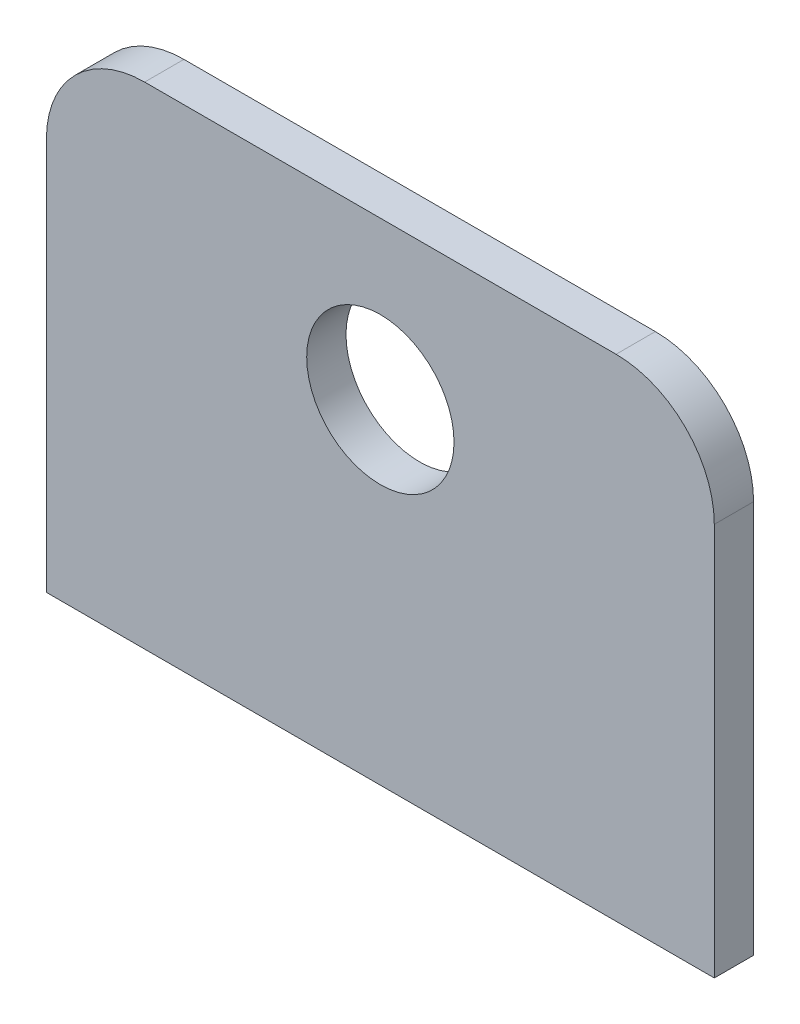
ISO-10303-21;
HEADER;
FILE_DESCRIPTION(('STEP AP214'),'2;1');
FILE_NAME('part.step','',(''),(''),'','','');
FILE_SCHEMA(('AUTOMOTIVE_DESIGN { 1 0 10303 214 1 1 1 1 }'));
ENDSEC;
DATA;
#1=APPLICATION_CONTEXT('core data for automotive mechanical design processes');
#2=APPLICATION_PROTOCOL_DEFINITION('international standard','automotive_design',2000,#1);
#3=PRODUCT_CONTEXT('',#1,'mechanical');
#4=PRODUCT('Part','Part','',(#3));
#5=PRODUCT_RELATED_PRODUCT_CATEGORY('part','',(#4));
#6=PRODUCT_DEFINITION_FORMATION('','',#4);
#7=PRODUCT_DEFINITION_CONTEXT('part definition',#1,'design');
#8=PRODUCT_DEFINITION('design','',#6,#7);
#9=PRODUCT_DEFINITION_SHAPE('','',#8);
#10=(LENGTH_UNIT() NAMED_UNIT(*) SI_UNIT(.MILLI.,.METRE.));
#11=(NAMED_UNIT(*) PLANE_ANGLE_UNIT() SI_UNIT($,.RADIAN.));
#12=(NAMED_UNIT(*) SI_UNIT($,.STERADIAN.) SOLID_ANGLE_UNIT());
#13=UNCERTAINTY_MEASURE_WITH_UNIT(LENGTH_MEASURE(1.E-05),#10,'distance_accuracy_value','');
#14=(GEOMETRIC_REPRESENTATION_CONTEXT(3) GLOBAL_UNCERTAINTY_ASSIGNED_CONTEXT((#13)) GLOBAL_UNIT_ASSIGNED_CONTEXT((#10,
#11,#12)) REPRESENTATION_CONTEXT('',''));
#15=CARTESIAN_POINT('',(0.,0.,0.));
#16=DIRECTION('',(0.,0.,1.));
#17=DIRECTION('',(1.,0.,0.));
#18=AXIS2_PLACEMENT_3D('',#15,#16,#17);
#19=CARTESIAN_POINT('',(0.,0.,4.));
#20=DIRECTION('',(-1.,0.,0.));
#21=DIRECTION('',(0.,0.,1.));
#22=AXIS2_PLACEMENT_3D('',#19,#20,#21);
#23=PLANE('',#22);
#24=DIRECTION('',(0.,1.,0.));
#25=VECTOR('',#24,1.);
#26=CARTESIAN_POINT('',(0.,0.,0.));
#27=LINE('',#26,#25);
#28=CARTESIAN_POINT('',(0.,0.,0.));
#29=VERTEX_POINT('',#28);
#30=CARTESIAN_POINT('',(0.,40.,0.));
#31=VERTEX_POINT('',#30);
#32=EDGE_CURVE('E118',#29,#31,#27,.T.);
#33=ORIENTED_EDGE('',*,*,#32,.T.);
#34=DIRECTION('',(0.,0.,-1.));
#35=VECTOR('',#34,1.);
#36=CARTESIAN_POINT('',(0.,40.,4.));
#37=LINE('',#36,#35);
#38=CARTESIAN_POINT('',(0.,40.,4.));
#39=VERTEX_POINT('',#38);
#40=EDGE_CURVE('E62',#31,#39,#37,.F.);
#41=ORIENTED_EDGE('',*,*,#40,.T.);
#42=DIRECTION('',(0.,1.,0.));
#43=VECTOR('',#42,1.);
#44=CARTESIAN_POINT('',(0.,0.,4.));
#45=LINE('',#44,#43);
#46=CARTESIAN_POINT('',(0.,0.,4.));
#47=VERTEX_POINT('',#46);
#48=EDGE_CURVE('E126',#47,#39,#45,.T.);
#49=ORIENTED_EDGE('',*,*,#48,.F.);
#50=DIRECTION('',(0.,0.,-1.));
#51=VECTOR('',#50,1.);
#52=CARTESIAN_POINT('',(0.,0.,4.));
#53=LINE('',#52,#51);
#54=EDGE_CURVE('E110',#47,#29,#53,.T.);
#55=ORIENTED_EDGE('',*,*,#54,.T.);
#56=EDGE_LOOP('',(#33,#41,#49,#55));
#57=FACE_BOUND('',#56,.T.);
#58=ADVANCED_FACE('F39',(#57),#23,.F.);
#59=CARTESIAN_POINT('',(0.,50.,4.));
#60=DIRECTION('',(0.,-1.,0.));
#61=DIRECTION('',(1.,0.,0.));
#62=AXIS2_PLACEMENT_3D('',#59,#60,#61);
#63=PLANE('',#62);
#64=DIRECTION('',(-1.,0.,0.));
#65=VECTOR('',#64,1.);
#66=CARTESIAN_POINT('',(0.,50.,4.));
#67=LINE('',#66,#65);
#68=CARTESIAN_POINT('',(-10.,50.,4.));
#69=VERTEX_POINT('',#68);
#70=CARTESIAN_POINT('',(-58.,50.,4.));
#71=VERTEX_POINT('',#70);
#72=EDGE_CURVE('E100',#69,#71,#67,.T.);
#73=ORIENTED_EDGE('',*,*,#72,.F.);
#74=DIRECTION('',(0.,0.,-1.));
#75=VECTOR('',#74,1.);
#76=CARTESIAN_POINT('',(-10.,50.,4.));
#77=LINE('',#76,#75);
#78=CARTESIAN_POINT('',(-10.,50.,0.));
#79=VERTEX_POINT('',#78);
#80=EDGE_CURVE('E129',#69,#79,#77,.T.);
#81=ORIENTED_EDGE('',*,*,#80,.T.);
#82=DIRECTION('',(-1.,0.,0.));
#83=VECTOR('',#82,1.);
#84=CARTESIAN_POINT('',(0.,50.,0.));
#85=LINE('',#84,#83);
#86=CARTESIAN_POINT('',(-58.,50.,0.));
#87=VERTEX_POINT('',#86);
#88=EDGE_CURVE('E120',#79,#87,#85,.T.);
#89=ORIENTED_EDGE('',*,*,#88,.T.);
#90=DIRECTION('',(0.,0.,-1.));
#91=VECTOR('',#90,1.);
#92=CARTESIAN_POINT('',(-58.,50.,4.));
#93=LINE('',#92,#91);
#94=EDGE_CURVE('E109',#87,#71,#93,.F.);
#95=ORIENTED_EDGE('',*,*,#94,.T.);
#96=EDGE_LOOP('',(#73,#81,#89,#95));
#97=FACE_BOUND('',#96,.T.);
#98=ADVANCED_FACE('F142',(#97),#63,.F.);
#99=CARTESIAN_POINT('',(-68.,0.,4.));
#100=DIRECTION('',(1.,0.,0.));
#101=DIRECTION('',(0.,0.,-1.));
#102=AXIS2_PLACEMENT_3D('',#99,#100,#101);
#103=PLANE('',#102);
#104=DIRECTION('',(0.,-1.,0.));
#105=VECTOR('',#104,1.);
#106=CARTESIAN_POINT('',(-68.,0.,4.));
#107=LINE('',#106,#105);
#108=CARTESIAN_POINT('',(-68.,40.,4.));
#109=VERTEX_POINT('',#108);
#110=CARTESIAN_POINT('',(-68.,0.,4.));
#111=VERTEX_POINT('',#110);
#112=EDGE_CURVE('E92',#109,#111,#107,.T.);
#113=ORIENTED_EDGE('',*,*,#112,.F.);
#114=DIRECTION('',(0.,0.,-1.));
#115=VECTOR('',#114,1.);
#116=CARTESIAN_POINT('',(-68.,40.,4.));
#117=LINE('',#116,#115);
#118=CARTESIAN_POINT('',(-68.,40.,0.));
#119=VERTEX_POINT('',#118);
#120=EDGE_CURVE('E11',#109,#119,#117,.T.);
#121=ORIENTED_EDGE('',*,*,#120,.T.);
#122=DIRECTION('',(0.,-1.,0.));
#123=VECTOR('',#122,1.);
#124=CARTESIAN_POINT('',(-68.,0.,0.));
#125=LINE('',#124,#123);
#126=CARTESIAN_POINT('',(-68.,0.,0.));
#127=VERTEX_POINT('',#126);
#128=EDGE_CURVE('E106',#119,#127,#125,.T.);
#129=ORIENTED_EDGE('',*,*,#128,.T.);
#130=DIRECTION('',(0.,0.,-1.));
#131=VECTOR('',#130,1.);
#132=CARTESIAN_POINT('',(-68.,0.,4.));
#133=LINE('',#132,#131);
#134=EDGE_CURVE('E103',#111,#127,#133,.T.);
#135=ORIENTED_EDGE('',*,*,#134,.F.);
#136=EDGE_LOOP('',(#113,#121,#129,#135));
#137=FACE_BOUND('',#136,.T.);
#138=ADVANCED_FACE('F104',(#137),#103,.F.);
#139=CARTESIAN_POINT('',(0.,0.,4.));
#140=DIRECTION('',(0.,1.,0.));
#141=DIRECTION('',(-1.,0.,0.));
#142=AXIS2_PLACEMENT_3D('',#139,#140,#141);
#143=PLANE('',#142);
#144=DIRECTION('',(1.,0.,0.));
#145=VECTOR('',#144,1.);
#146=CARTESIAN_POINT('',(0.,0.,0.));
#147=LINE('',#146,#145);
#148=EDGE_CURVE('E125',#127,#29,#147,.T.);
#149=ORIENTED_EDGE('',*,*,#148,.T.);
#150=ORIENTED_EDGE('',*,*,#54,.F.);
#151=DIRECTION('',(1.,0.,0.));
#152=VECTOR('',#151,1.);
#153=CARTESIAN_POINT('',(0.,0.,4.));
#154=LINE('',#153,#152);
#155=EDGE_CURVE('E96',#111,#47,#154,.T.);
#156=ORIENTED_EDGE('',*,*,#155,.F.);
#157=ORIENTED_EDGE('',*,*,#134,.T.);
#158=EDGE_LOOP('',(#149,#150,#156,#157));
#159=FACE_BOUND('',#158,.T.);
#160=ADVANCED_FACE('F112',(#159),#143,.F.);
#161=CARTESIAN_POINT('',(0.,0.,4.));
#162=DIRECTION('',(0.,0.,1.));
#163=DIRECTION('',(1.,0.,0.));
#164=AXIS2_PLACEMENT_3D('',#161,#162,#163);
#165=PLANE('',#164);
#166=CARTESIAN_POINT('',(-34.,34.,4.));
#167=DIRECTION('',(0.,0.,1.));
#168=DIRECTION('',(1.,0.,0.));
#169=AXIS2_PLACEMENT_3D('',#166,#167,#168);
#170=CIRCLE('',#169,7.5);
#171=CARTESIAN_POINT('',(-26.5,34.,4.));
#172=VERTEX_POINT('',#171);
#173=EDGE_CURVE('E121',#172,#172,#170,.T.);
#174=ORIENTED_EDGE('',*,*,#173,.F.);
#175=EDGE_LOOP('',(#174));
#176=FACE_BOUND('',#175,.T.);
#177=ORIENTED_EDGE('',*,*,#48,.T.);
#178=CARTESIAN_POINT('',(-10.,40.,4.));
#179=DIRECTION('',(0.,0.,1.));
#180=DIRECTION('',(1.,0.,0.));
#181=AXIS2_PLACEMENT_3D('',#178,#179,#180);
#182=CIRCLE('',#181,10.);
#183=EDGE_CURVE('E47',#39,#69,#182,.T.);
#184=ORIENTED_EDGE('',*,*,#183,.T.);
#185=ORIENTED_EDGE('',*,*,#72,.T.);
#186=CARTESIAN_POINT('',(-58.,40.,4.));
#187=DIRECTION('',(0.,0.,1.));
#188=DIRECTION('',(1.,0.,0.));
#189=AXIS2_PLACEMENT_3D('',#186,#187,#188);
#190=CIRCLE('',#189,10.);
#191=EDGE_CURVE('E54',#71,#109,#190,.T.);
#192=ORIENTED_EDGE('',*,*,#191,.T.);
#193=ORIENTED_EDGE('',*,*,#112,.T.);
#194=ORIENTED_EDGE('',*,*,#155,.T.);
#195=EDGE_LOOP('',(#177,#184,#185,#192,#193,#194));
#196=FACE_BOUND('',#195,.T.);
#197=ADVANCED_FACE('F94',(#176,#196),#165,.T.);
#198=CARTESIAN_POINT('',(0.,0.,0.));
#199=DIRECTION('',(0.,0.,1.));
#200=DIRECTION('',(1.,0.,0.));
#201=AXIS2_PLACEMENT_3D('',#198,#199,#200);
#202=PLANE('',#201);
#203=CARTESIAN_POINT('',(-34.,34.,0.));
#204=DIRECTION('',(0.,0.,-1.));
#205=DIRECTION('',(-1.,0.,0.));
#206=AXIS2_PLACEMENT_3D('',#203,#204,#205);
#207=CIRCLE('',#206,7.5);
#208=CARTESIAN_POINT('',(-41.5,34.,0.));
#209=VERTEX_POINT('',#208);
#210=EDGE_CURVE('E153',#209,#209,#207,.T.);
#211=ORIENTED_EDGE('',*,*,#210,.F.);
#212=EDGE_LOOP('',(#211));
#213=FACE_BOUND('',#212,.T.);
#214=ORIENTED_EDGE('',*,*,#88,.F.);
#215=CARTESIAN_POINT('',(-10.,40.,0.));
#216=DIRECTION('',(0.,0.,1.));
#217=DIRECTION('',(1.,0.,0.));
#218=AXIS2_PLACEMENT_3D('',#215,#216,#217);
#219=CIRCLE('',#218,10.);
#220=EDGE_CURVE('E134',#79,#31,#219,.F.);
#221=ORIENTED_EDGE('',*,*,#220,.T.);
#222=ORIENTED_EDGE('',*,*,#32,.F.);
#223=ORIENTED_EDGE('',*,*,#148,.F.);
#224=ORIENTED_EDGE('',*,*,#128,.F.);
#225=CARTESIAN_POINT('',(-58.,40.,0.));
#226=DIRECTION('',(0.,0.,1.));
#227=DIRECTION('',(1.,0.,0.));
#228=AXIS2_PLACEMENT_3D('',#225,#226,#227);
#229=CIRCLE('',#228,10.);
#230=EDGE_CURVE('E132',#119,#87,#229,.F.);
#231=ORIENTED_EDGE('',*,*,#230,.T.);
#232=EDGE_LOOP('',(#214,#221,#222,#223,#224,#231));
#233=FACE_BOUND('',#232,.T.);
#234=ADVANCED_FACE('F148',(#213,#233),#202,.F.);
#235=CARTESIAN_POINT('',(-34.,34.,10.));
#236=DIRECTION('',(0.,0.,-1.));
#237=DIRECTION('',(-1.,0.,0.));
#238=AXIS2_PLACEMENT_3D('',#235,#236,#237);
#239=CYLINDRICAL_SURFACE('',#238,7.5);
#240=ORIENTED_EDGE('',*,*,#173,.T.);
#241=EDGE_LOOP('',(#240));
#242=FACE_BOUND('',#241,.T.);
#243=ORIENTED_EDGE('',*,*,#210,.T.);
#244=EDGE_LOOP('',(#243));
#245=FACE_BOUND('',#244,.T.);
#246=ADVANCED_FACE('F157',(#242,#245),#239,.F.);
#247=CARTESIAN_POINT('',(-10.,40.,4.));
#248=DIRECTION('',(0.,0.,-1.));
#249=DIRECTION('',(-1.,0.,0.));
#250=AXIS2_PLACEMENT_3D('',#247,#248,#249);
#251=CYLINDRICAL_SURFACE('',#250,10.);
#252=ORIENTED_EDGE('',*,*,#183,.F.);
#253=ORIENTED_EDGE('',*,*,#40,.F.);
#254=ORIENTED_EDGE('',*,*,#220,.F.);
#255=ORIENTED_EDGE('',*,*,#80,.F.);
#256=EDGE_LOOP('',(#252,#253,#254,#255));
#257=FACE_BOUND('',#256,.T.);
#258=ADVANCED_FACE('F145',(#257),#251,.T.);
#259=CARTESIAN_POINT('',(-58.,40.,4.));
#260=DIRECTION('',(0.,0.,-1.));
#261=DIRECTION('',(-1.,0.,0.));
#262=AXIS2_PLACEMENT_3D('',#259,#260,#261);
#263=CYLINDRICAL_SURFACE('',#262,10.);
#264=ORIENTED_EDGE('',*,*,#191,.F.);
#265=ORIENTED_EDGE('',*,*,#94,.F.);
#266=ORIENTED_EDGE('',*,*,#230,.F.);
#267=ORIENTED_EDGE('',*,*,#120,.F.);
#268=EDGE_LOOP('',(#264,#265,#266,#267));
#269=FACE_BOUND('',#268,.T.);
#270=ADVANCED_FACE('F41',(#269),#263,.T.);
#271=CLOSED_SHELL('',(#58,#98,#138,#160,#197,#234,#246,#258,#270));
#272=MANIFOLD_SOLID_BREP('B2',#271);
#273=ADVANCED_BREP_SHAPE_REPRESENTATION('',(#18,#272),#14);
#274=SHAPE_DEFINITION_REPRESENTATION(#9,#273);
ENDSEC;
END-ISO-10303-21;
